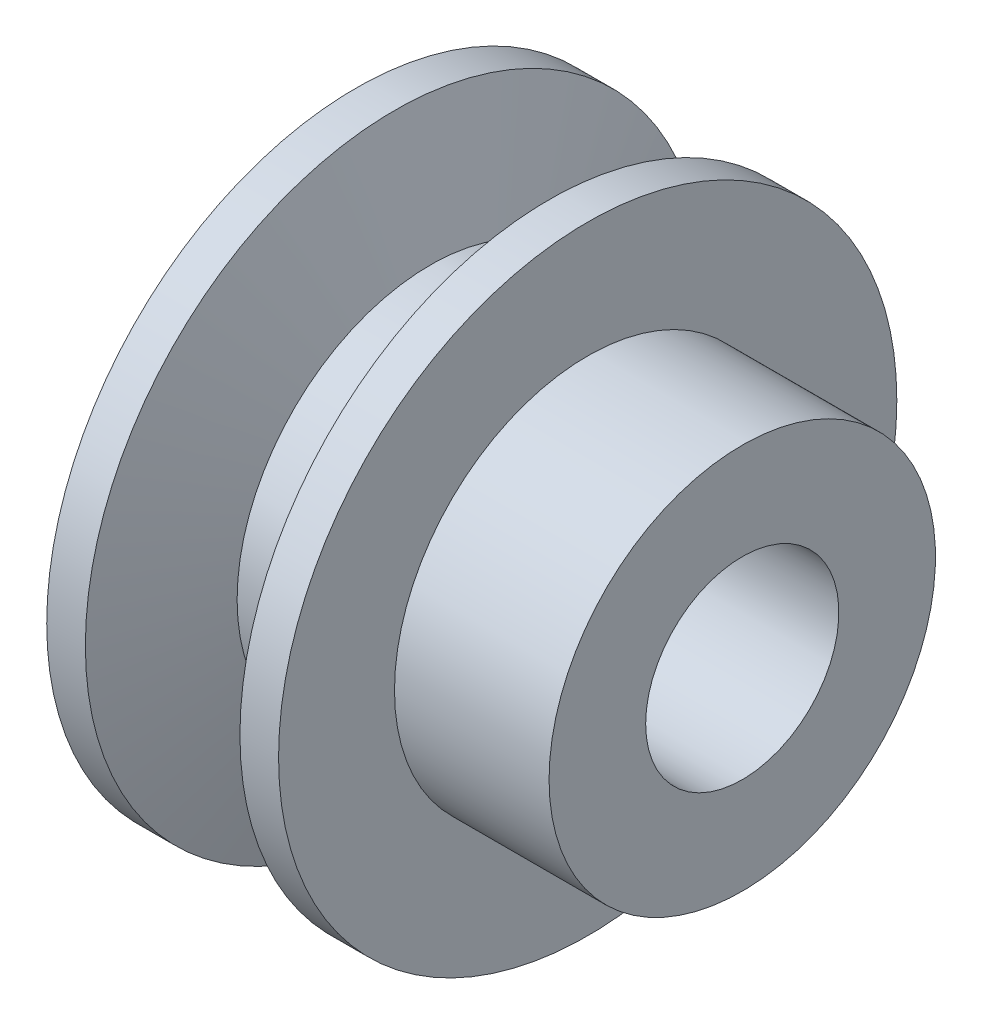
ISO-10303-21;
HEADER;
FILE_DESCRIPTION(('STEP AP214'),'2;1');
FILE_NAME('part.step','',(''),(''),'','','');
FILE_SCHEMA(('AUTOMOTIVE_DESIGN { 1 0 10303 214 1 1 1 1 }'));
ENDSEC;
DATA;
#1=APPLICATION_CONTEXT('core data for automotive mechanical design processes');
#2=APPLICATION_PROTOCOL_DEFINITION('international standard','automotive_design',2000,#1);
#3=PRODUCT_CONTEXT('',#1,'mechanical');
#4=PRODUCT('Part','Part','',(#3));
#5=PRODUCT_RELATED_PRODUCT_CATEGORY('part','',(#4));
#6=PRODUCT_DEFINITION_FORMATION('','',#4);
#7=PRODUCT_DEFINITION_CONTEXT('part definition',#1,'design');
#8=PRODUCT_DEFINITION('design','',#6,#7);
#9=PRODUCT_DEFINITION_SHAPE('','',#8);
#10=(LENGTH_UNIT() NAMED_UNIT(*) SI_UNIT(.MILLI.,.METRE.));
#11=(NAMED_UNIT(*) PLANE_ANGLE_UNIT() SI_UNIT($,.RADIAN.));
#12=(NAMED_UNIT(*) SI_UNIT($,.STERADIAN.) SOLID_ANGLE_UNIT());
#13=UNCERTAINTY_MEASURE_WITH_UNIT(LENGTH_MEASURE(1.E-05),#10,'distance_accuracy_value','');
#14=(GEOMETRIC_REPRESENTATION_CONTEXT(3) GLOBAL_UNCERTAINTY_ASSIGNED_CONTEXT((#13)) GLOBAL_UNIT_ASSIGNED_CONTEXT((#10,
#11,#12)) REPRESENTATION_CONTEXT('',''));
#15=CARTESIAN_POINT('',(0.,0.,0.));
#16=DIRECTION('',(0.,0.,1.));
#17=DIRECTION('',(1.,0.,0.));
#18=AXIS2_PLACEMENT_3D('',#15,#16,#17);
#19=CARTESIAN_POINT('',(0.,0.,0.));
#20=DIRECTION('',(-1.,0.,0.));
#21=DIRECTION('',(0.,0.,1.));
#22=AXIS2_PLACEMENT_3D('',#19,#20,#21);
#23=CYLINDRICAL_SURFACE('',#22,635.);
#24=CARTESIAN_POINT('',(244.737675707417,0.,0.));
#25=DIRECTION('',(-1.,0.,0.));
#26=DIRECTION('',(0.,0.,1.));
#27=AXIS2_PLACEMENT_3D('',#24,#25,#26);
#28=CIRCLE('',#27,635.);
#29=CARTESIAN_POINT('',(244.737675707417,0.,635.));
#30=VERTEX_POINT('',#29);
#31=EDGE_CURVE('E87',#30,#30,#28,.T.);
#32=ORIENTED_EDGE('',*,*,#31,.F.);
#33=EDGE_LOOP('',(#32));
#34=FACE_BOUND('',#33,.T.);
#35=CARTESIAN_POINT('',(474.625871083202,0.,0.));
#36=DIRECTION('',(-1.,0.,0.));
#37=DIRECTION('',(0.,0.,1.));
#38=AXIS2_PLACEMENT_3D('',#35,#36,#37);
#39=CIRCLE('',#38,635.);
#40=CARTESIAN_POINT('',(474.625871083202,0.,635.));
#41=VERTEX_POINT('',#40);
#42=EDGE_CURVE('E10',#41,#41,#39,.T.);
#43=ORIENTED_EDGE('',*,*,#42,.T.);
#44=EDGE_LOOP('',(#43));
#45=FACE_BOUND('',#44,.T.);
#46=ADVANCED_FACE('F40',(#34,#45),#23,.T.);
#47=CARTESIAN_POINT('',(635.,0.,0.));
#48=DIRECTION('',(1.,0.,0.));
#49=DIRECTION('',(0.,0.,-1.));
#50=AXIS2_PLACEMENT_3D('',#47,#48,#49);
#51=CONICAL_SURFACE('',#50,1016.,1.17237849874249);
#52=ORIENTED_EDGE('',*,*,#42,.F.);
#53=EDGE_LOOP('',(#52));
#54=FACE_BOUND('',#53,.T.);
#55=CARTESIAN_POINT('',(635.,0.,0.));
#56=DIRECTION('',(-1.,0.,0.));
#57=DIRECTION('',(0.,0.,1.));
#58=AXIS2_PLACEMENT_3D('',#55,#56,#57);
#59=CIRCLE('',#58,1016.);
#60=CARTESIAN_POINT('',(635.,0.,1016.));
#61=VERTEX_POINT('',#60);
#62=EDGE_CURVE('E47',#61,#61,#59,.T.);
#63=ORIENTED_EDGE('',*,*,#62,.T.);
#64=EDGE_LOOP('',(#63));
#65=FACE_BOUND('',#64,.T.);
#66=ADVANCED_FACE('F95',(#54,#65),#51,.T.);
#67=CARTESIAN_POINT('',(0.,0.,0.));
#68=DIRECTION('',(-1.,0.,0.));
#69=DIRECTION('',(0.,0.,1.));
#70=AXIS2_PLACEMENT_3D('',#67,#68,#69);
#71=CYLINDRICAL_SURFACE('',#70,1016.);
#72=ORIENTED_EDGE('',*,*,#62,.F.);
#73=EDGE_LOOP('',(#72));
#74=FACE_BOUND('',#73,.T.);
#75=CARTESIAN_POINT('',(762.,0.,0.));
#76=DIRECTION('',(-1.,0.,0.));
#77=DIRECTION('',(0.,0.,1.));
#78=AXIS2_PLACEMENT_3D('',#75,#76,#77);
#79=CIRCLE('',#78,1016.);
#80=CARTESIAN_POINT('',(762.,0.,1016.));
#81=VERTEX_POINT('',#80);
#82=EDGE_CURVE('E52',#81,#81,#79,.T.);
#83=ORIENTED_EDGE('',*,*,#82,.T.);
#84=EDGE_LOOP('',(#83));
#85=FACE_BOUND('',#84,.T.);
#86=ADVANCED_FACE('F99',(#74,#85),#71,.T.);
#87=CARTESIAN_POINT('',(762.,635.,0.));
#88=DIRECTION('',(-1.,0.,0.));
#89=DIRECTION('',(0.,0.,1.));
#90=AXIS2_PLACEMENT_3D('',#87,#88,#89);
#91=PLANE('',#90);
#92=ORIENTED_EDGE('',*,*,#82,.F.);
#93=EDGE_LOOP('',(#92));
#94=FACE_BOUND('',#93,.T.);
#95=CARTESIAN_POINT('',(762.,0.,0.));
#96=DIRECTION('',(-1.,0.,0.));
#97=DIRECTION('',(0.,0.,1.));
#98=AXIS2_PLACEMENT_3D('',#95,#96,#97);
#99=CIRCLE('',#98,635.);
#100=CARTESIAN_POINT('',(762.,0.,635.));
#101=VERTEX_POINT('',#100);
#102=EDGE_CURVE('E57',#101,#101,#99,.T.);
#103=ORIENTED_EDGE('',*,*,#102,.T.);
#104=EDGE_LOOP('',(#103));
#105=FACE_BOUND('',#104,.T.);
#106=ADVANCED_FACE('F104',(#94,#105),#91,.F.);
#107=CARTESIAN_POINT('',(0.,0.,0.));
#108=DIRECTION('',(-1.,0.,0.));
#109=DIRECTION('',(0.,0.,1.));
#110=AXIS2_PLACEMENT_3D('',#107,#108,#109);
#111=CYLINDRICAL_SURFACE('',#110,635.);
#112=ORIENTED_EDGE('',*,*,#102,.F.);
#113=EDGE_LOOP('',(#112));
#114=FACE_BOUND('',#113,.T.);
#115=CARTESIAN_POINT('',(1270.,0.,0.));
#116=DIRECTION('',(-1.,0.,0.));
#117=DIRECTION('',(0.,0.,1.));
#118=AXIS2_PLACEMENT_3D('',#115,#116,#117);
#119=CIRCLE('',#118,635.);
#120=CARTESIAN_POINT('',(1270.,0.,635.));
#121=VERTEX_POINT('',#120);
#122=EDGE_CURVE('E63',#121,#121,#119,.T.);
#123=ORIENTED_EDGE('',*,*,#122,.T.);
#124=EDGE_LOOP('',(#123));
#125=FACE_BOUND('',#124,.T.);
#126=ADVANCED_FACE('F110',(#114,#125),#111,.T.);
#127=CARTESIAN_POINT('',(1270.,317.5,0.));
#128=DIRECTION('',(-1.,0.,0.));
#129=DIRECTION('',(0.,0.,1.));
#130=AXIS2_PLACEMENT_3D('',#127,#128,#129);
#131=PLANE('',#130);
#132=ORIENTED_EDGE('',*,*,#122,.F.);
#133=EDGE_LOOP('',(#132));
#134=FACE_BOUND('',#133,.T.);
#135=CARTESIAN_POINT('',(1270.,0.,0.));
#136=DIRECTION('',(-1.,0.,0.));
#137=DIRECTION('',(0.,0.,1.));
#138=AXIS2_PLACEMENT_3D('',#135,#136,#137);
#139=CIRCLE('',#138,317.5);
#140=CARTESIAN_POINT('',(1270.,0.,317.5));
#141=VERTEX_POINT('',#140);
#142=EDGE_CURVE('E67',#141,#141,#139,.T.);
#143=ORIENTED_EDGE('',*,*,#142,.T.);
#144=EDGE_LOOP('',(#143));
#145=FACE_BOUND('',#144,.T.);
#146=ADVANCED_FACE('F114',(#134,#145),#131,.F.);
#147=CARTESIAN_POINT('',(0.,0.,0.));
#148=DIRECTION('',(-1.,0.,0.));
#149=DIRECTION('',(0.,0.,1.));
#150=AXIS2_PLACEMENT_3D('',#147,#148,#149);
#151=CYLINDRICAL_SURFACE('',#150,317.5);
#152=ORIENTED_EDGE('',*,*,#142,.F.);
#153=EDGE_LOOP('',(#152));
#154=FACE_BOUND('',#153,.T.);
#155=CARTESIAN_POINT('',(190.5,0.,0.));
#156=DIRECTION('',(-1.,0.,0.));
#157=DIRECTION('',(0.,0.,1.));
#158=AXIS2_PLACEMENT_3D('',#155,#156,#157);
#159=CIRCLE('',#158,317.5);
#160=CARTESIAN_POINT('',(190.5,0.,317.5));
#161=VERTEX_POINT('',#160);
#162=EDGE_CURVE('E71',#161,#161,#159,.T.);
#163=ORIENTED_EDGE('',*,*,#162,.T.);
#164=EDGE_LOOP('',(#163));
#165=FACE_BOUND('',#164,.T.);
#166=ADVANCED_FACE('F118',(#154,#165),#151,.F.);
#167=CARTESIAN_POINT('',(0.,0.,0.));
#168=DIRECTION('',(-1.,0.,0.));
#169=DIRECTION('',(0.,0.,1.));
#170=AXIS2_PLACEMENT_3D('',#167,#168,#169);
#171=CONICAL_SURFACE('',#170,508.,0.78539816339745);
#172=ORIENTED_EDGE('',*,*,#162,.F.);
#173=EDGE_LOOP('',(#172));
#174=FACE_BOUND('',#173,.T.);
#175=CARTESIAN_POINT('',(0.,0.,0.));
#176=DIRECTION('',(-1.,0.,0.));
#177=DIRECTION('',(0.,0.,1.));
#178=AXIS2_PLACEMENT_3D('',#175,#176,#177);
#179=CIRCLE('',#178,508.);
#180=CARTESIAN_POINT('',(0.,0.,508.));
#181=VERTEX_POINT('',#180);
#182=EDGE_CURVE('E75',#181,#181,#179,.T.);
#183=ORIENTED_EDGE('',*,*,#182,.T.);
#184=EDGE_LOOP('',(#183));
#185=FACE_BOUND('',#184,.T.);
#186=ADVANCED_FACE('F122',(#174,#185),#171,.F.);
#187=CARTESIAN_POINT('',(0.,508.,0.));
#188=DIRECTION('',(1.,0.,0.));
#189=DIRECTION('',(0.,0.,-1.));
#190=AXIS2_PLACEMENT_3D('',#187,#188,#189);
#191=PLANE('',#190);
#192=ORIENTED_EDGE('',*,*,#182,.F.);
#193=EDGE_LOOP('',(#192));
#194=FACE_BOUND('',#193,.T.);
#195=CARTESIAN_POINT('',(0.,0.,0.));
#196=DIRECTION('',(-1.,0.,0.));
#197=DIRECTION('',(0.,0.,1.));
#198=AXIS2_PLACEMENT_3D('',#195,#196,#197);
#199=CIRCLE('',#198,1016.);
#200=CARTESIAN_POINT('',(0.,0.,1016.));
#201=VERTEX_POINT('',#200);
#202=EDGE_CURVE('E79',#201,#201,#199,.T.);
#203=ORIENTED_EDGE('',*,*,#202,.T.);
#204=EDGE_LOOP('',(#203));
#205=FACE_BOUND('',#204,.T.);
#206=ADVANCED_FACE('F126',(#194,#205),#191,.F.);
#207=CARTESIAN_POINT('',(0.,0.,0.));
#208=DIRECTION('',(-1.,0.,0.));
#209=DIRECTION('',(0.,0.,1.));
#210=AXIS2_PLACEMENT_3D('',#207,#208,#209);
#211=CYLINDRICAL_SURFACE('',#210,1016.);
#212=ORIENTED_EDGE('',*,*,#202,.F.);
#213=EDGE_LOOP('',(#212));
#214=FACE_BOUND('',#213,.T.);
#215=CARTESIAN_POINT('',(127.,0.,0.));
#216=DIRECTION('',(-1.,0.,0.));
#217=DIRECTION('',(0.,0.,1.));
#218=AXIS2_PLACEMENT_3D('',#215,#216,#217);
#219=CIRCLE('',#218,1016.);
#220=CARTESIAN_POINT('',(127.,0.,1016.));
#221=VERTEX_POINT('',#220);
#222=EDGE_CURVE('E83',#221,#221,#219,.T.);
#223=ORIENTED_EDGE('',*,*,#222,.T.);
#224=EDGE_LOOP('',(#223));
#225=FACE_BOUND('',#224,.T.);
#226=ADVANCED_FACE('F130',(#214,#225),#211,.T.);
#227=CARTESIAN_POINT('',(244.737675707417,0.,0.));
#228=DIRECTION('',(-1.,0.,0.));
#229=DIRECTION('',(0.,0.,1.));
#230=AXIS2_PLACEMENT_3D('',#227,#228,#229);
#231=CONICAL_SURFACE('',#230,635.,1.27108245404957);
#232=ORIENTED_EDGE('',*,*,#222,.F.);
#233=EDGE_LOOP('',(#232));
#234=FACE_BOUND('',#233,.T.);
#235=ORIENTED_EDGE('',*,*,#31,.T.);
#236=EDGE_LOOP('',(#235));
#237=FACE_BOUND('',#236,.T.);
#238=ADVANCED_FACE('F92',(#234,#237),#231,.T.);
#239=CLOSED_SHELL('',(#46,#66,#86,#106,#126,#146,#166,#186,#206,#226,#238));
#240=MANIFOLD_SOLID_BREP('B2',#239);
#241=ADVANCED_BREP_SHAPE_REPRESENTATION('',(#18,#240),#14);
#242=SHAPE_DEFINITION_REPRESENTATION(#9,#241);
ENDSEC;
END-ISO-10303-21;
